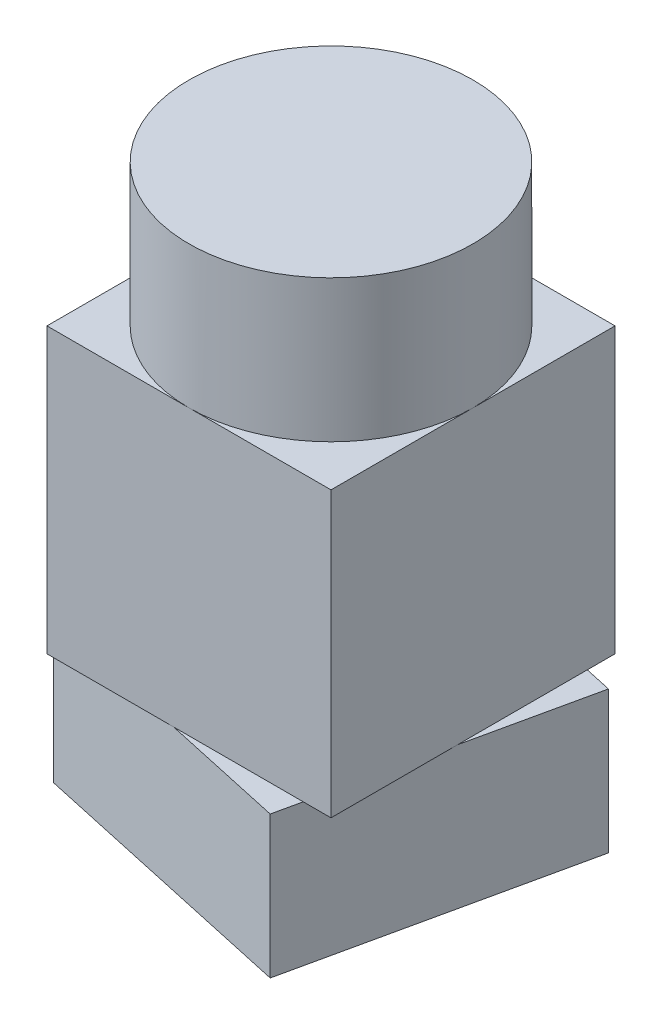
ISO-10303-21;
HEADER;
FILE_DESCRIPTION(('STEP AP214'),'2;1');
FILE_NAME('part.step','',(''),(''),'','','');
FILE_SCHEMA(('AUTOMOTIVE_DESIGN { 1 0 10303 214 1 1 1 1 }'));
ENDSEC;
DATA;
#1=APPLICATION_CONTEXT('core data for automotive mechanical design processes');
#2=APPLICATION_PROTOCOL_DEFINITION('international standard','automotive_design',2000,#1);
#3=PRODUCT_CONTEXT('',#1,'mechanical');
#4=PRODUCT('Part','Part','',(#3));
#5=PRODUCT_RELATED_PRODUCT_CATEGORY('part','',(#4));
#6=PRODUCT_DEFINITION_FORMATION('','',#4);
#7=PRODUCT_DEFINITION_CONTEXT('part definition',#1,'design');
#8=PRODUCT_DEFINITION('design','',#6,#7);
#9=PRODUCT_DEFINITION_SHAPE('','',#8);
#10=(LENGTH_UNIT() NAMED_UNIT(*) SI_UNIT(.MILLI.,.METRE.));
#11=(NAMED_UNIT(*) PLANE_ANGLE_UNIT() SI_UNIT($,.RADIAN.));
#12=(NAMED_UNIT(*) SI_UNIT($,.STERADIAN.) SOLID_ANGLE_UNIT());
#13=UNCERTAINTY_MEASURE_WITH_UNIT(LENGTH_MEASURE(1.E-05),#10,'distance_accuracy_value','');
#14=(GEOMETRIC_REPRESENTATION_CONTEXT(3) GLOBAL_UNCERTAINTY_ASSIGNED_CONTEXT((#13)) GLOBAL_UNIT_ASSIGNED_CONTEXT((#10,
#11,#12)) REPRESENTATION_CONTEXT('',''));
#15=CARTESIAN_POINT('',(0.,0.,0.));
#16=DIRECTION('',(0.,0.,1.));
#17=DIRECTION('',(1.,0.,0.));
#18=AXIS2_PLACEMENT_3D('',#15,#16,#17);
#19=CARTESIAN_POINT('',(0.,-4.,0.));
#20=DIRECTION('',(0.,-1.,0.));
#21=DIRECTION('',(0.,0.,-1.));
#22=AXIS2_PLACEMENT_3D('',#19,#20,#21);
#23=PLANE('',#22);
#24=DIRECTION('',(-1.,0.,0.));
#25=VECTOR('',#24,1.);
#26=CARTESIAN_POINT('',(0.,-4.,-58.3815572471546));
#27=LINE('',#26,#25);
#28=CARTESIAN_POINT('',(2.,-4.,-58.3815572471546));
#29=VERTEX_POINT('',#28);
#30=CARTESIAN_POINT('',(0.,-4.,-58.3815572471546));
#31=VERTEX_POINT('',#30);
#32=EDGE_CURVE('E144',#29,#31,#27,.T.);
#33=ORIENTED_EDGE('',*,*,#32,.T.);
#34=CARTESIAN_POINT('',(0.,-4.,-56.3815572471546));
#35=DIRECTION('',(0.,-1.,0.));
#36=DIRECTION('',(0.,0.,-1.));
#37=AXIS2_PLACEMENT_3D('',#34,#35,#36);
#38=CIRCLE('',#37,2.);
#39=CARTESIAN_POINT('',(2.,-4.,-56.3815572471546));
#40=VERTEX_POINT('',#39);
#41=EDGE_CURVE('E44',#31,#40,#38,.T.);
#42=ORIENTED_EDGE('',*,*,#41,.T.);
#43=DIRECTION('',(0.,0.,1.));
#44=VECTOR('',#43,1.);
#45=CARTESIAN_POINT('',(2.,-4.,0.));
#46=LINE('',#45,#44);
#47=EDGE_CURVE('E142',#29,#40,#46,.T.);
#48=ORIENTED_EDGE('',*,*,#47,.F.);
#49=EDGE_LOOP('',(#33,#42,#48));
#50=FACE_BOUND('',#49,.T.);
#51=ADVANCED_FACE('F33',(#50),#23,.F.);
#52=CARTESIAN_POINT('',(2.,-4.,-54.3815572471546));
#53=VERTEX_POINT('',#52);
#54=EDGE_CURVE('E147',#40,#53,#46,.T.);
#55=ORIENTED_EDGE('',*,*,#54,.F.);
#56=CARTESIAN_POINT('',(0.,-4.,-54.3815572471546));
#57=VERTEX_POINT('',#56);
#58=EDGE_CURVE('E11',#40,#57,#38,.T.);
#59=ORIENTED_EDGE('',*,*,#58,.T.);
#60=DIRECTION('',(-1.,0.,0.));
#61=VECTOR('',#60,1.);
#62=CARTESIAN_POINT('',(0.,-4.,-54.3815572471546));
#63=LINE('',#62,#61);
#64=EDGE_CURVE('E150',#53,#57,#63,.T.);
#65=ORIENTED_EDGE('',*,*,#64,.F.);
#66=EDGE_LOOP('',(#55,#59,#65));
#67=FACE_BOUND('',#66,.T.);
#68=ADVANCED_FACE('F148',(#67),#23,.F.);
#69=CARTESIAN_POINT('',(-2.,-4.,-54.3815572471546));
#70=VERTEX_POINT('',#69);
#71=EDGE_CURVE('E160',#57,#70,#63,.T.);
#72=ORIENTED_EDGE('',*,*,#71,.F.);
#73=CARTESIAN_POINT('',(-2.,-4.,-56.3815572471546));
#74=VERTEX_POINT('',#73);
#75=EDGE_CURVE('E42',#57,#74,#38,.T.);
#76=ORIENTED_EDGE('',*,*,#75,.T.);
#77=DIRECTION('',(0.,0.,1.));
#78=VECTOR('',#77,1.);
#79=CARTESIAN_POINT('',(-2.00000000000001,-4.,0.));
#80=LINE('',#79,#78);
#81=EDGE_CURVE('E241',#74,#70,#80,.T.);
#82=ORIENTED_EDGE('',*,*,#81,.T.);
#83=EDGE_LOOP('',(#72,#76,#82));
#84=FACE_BOUND('',#83,.T.);
#85=ADVANCED_FACE('F293',(#84),#23,.F.);
#86=CARTESIAN_POINT('',(0.,-8.,0.));
#87=DIRECTION('',(0.,1.,0.));
#88=DIRECTION('',(0.,0.,1.));
#89=AXIS2_PLACEMENT_3D('',#86,#87,#88);
#90=PLANE('',#89);
#91=DIRECTION('',(-0.214029557563819,0.,0.976827184556734));
#92=VECTOR('',#91,1.);
#93=CARTESIAN_POINT('',(-1.52559525398583,-8.,-58.7632707313957));
#94=LINE('',#93,#92);
#95=CARTESIAN_POINT('',(-1.52559525398583,-8.,-58.7632707313957));
#96=VERTEX_POINT('',#95);
#97=CARTESIAN_POINT('',(-1.60923130490649,-8.,-58.3815572471546));
#98=VERTEX_POINT('',#97);
#99=EDGE_CURVE('E165',#96,#98,#94,.T.);
#100=ORIENTED_EDGE('',*,*,#99,.T.);
#101=DIRECTION('',(1.,0.,0.));
#102=VECTOR('',#101,1.);
#103=CARTESIAN_POINT('',(0.,-8.,-58.3815572471546));
#104=LINE('',#103,#102);
#105=CARTESIAN_POINT('',(0.216538460454042,-8.,-58.3815572471546));
#106=VERTEX_POINT('',#105);
#107=EDGE_CURVE('E236',#98,#106,#104,.T.);
#108=ORIENTED_EDGE('',*,*,#107,.T.);
#109=DIRECTION('',(0.976827184556734,0.,0.214029557563819));
#110=VECTOR('',#109,1.);
#111=CARTESIAN_POINT('',(-1.52559525398583,-8.,-58.7632707313957));
#112=LINE('',#111,#110);
#113=EDGE_CURVE('E181',#96,#106,#112,.T.);
#114=ORIENTED_EDGE('',*,*,#113,.F.);
#115=EDGE_LOOP('',(#100,#108,#114));
#116=FACE_BOUND('',#115,.T.);
#117=ADVANCED_FACE('F274',(#116),#90,.T.);
#118=DIRECTION('',(0.,0.,-1.));
#119=VECTOR('',#118,1.);
#120=CARTESIAN_POINT('',(2.,-8.,0.));
#121=LINE('',#120,#119);
#122=CARTESIAN_POINT('',(2.,-8.,-56.1650187867006));
#123=VERTEX_POINT('',#122);
#124=CARTESIAN_POINT('',(2.,-8.,-57.9907885520611));
#125=VERTEX_POINT('',#124);
#126=EDGE_CURVE('E216',#123,#125,#121,.T.);
#127=ORIENTED_EDGE('',*,*,#126,.F.);
#128=DIRECTION('',(-0.214029557563819,0.,0.976827184556734));
#129=VECTOR('',#128,1.);
#130=CARTESIAN_POINT('',(2.38171348424111,-8.,-57.9071525011405));
#131=LINE('',#130,#129);
#132=CARTESIAN_POINT('',(2.38171348424111,-8.,-57.9071525011405));
#133=VERTEX_POINT('',#132);
#134=EDGE_CURVE('E176',#133,#123,#131,.T.);
#135=ORIENTED_EDGE('',*,*,#134,.F.);
#136=EDGE_CURVE('E179',#125,#133,#112,.T.);
#137=ORIENTED_EDGE('',*,*,#136,.F.);
#138=EDGE_LOOP('',(#127,#135,#137));
#139=FACE_BOUND('',#138,.T.);
#140=ADVANCED_FACE('F301',(#139),#90,.T.);
#141=DIRECTION('',(0.976827184556734,0.,0.214029557563819));
#142=VECTOR('',#141,1.);
#143=CARTESIAN_POINT('',(-2.38171348424111,-8.,-54.8559619931688));
#144=LINE('',#143,#142);
#145=CARTESIAN_POINT('',(-2.38171348424111,-8.,-54.8559619931688));
#146=VERTEX_POINT('',#145);
#147=CARTESIAN_POINT('',(-2.,-8.,-54.7723259422482));
#148=VERTEX_POINT('',#147);
#149=EDGE_CURVE('E171',#146,#148,#144,.T.);
#150=ORIENTED_EDGE('',*,*,#149,.T.);
#151=DIRECTION('',(0.,0.,-1.));
#152=VECTOR('',#151,1.);
#153=CARTESIAN_POINT('',(-2.00000000000001,-8.,0.));
#154=LINE('',#153,#152);
#155=CARTESIAN_POINT('',(-2.,-8.,-56.5980957076087));
#156=VERTEX_POINT('',#155);
#157=EDGE_CURVE('E205',#148,#156,#154,.T.);
#158=ORIENTED_EDGE('',*,*,#157,.T.);
#159=EDGE_CURVE('E170',#156,#146,#94,.T.);
#160=ORIENTED_EDGE('',*,*,#159,.T.);
#161=EDGE_LOOP('',(#150,#158,#160));
#162=FACE_BOUND('',#161,.T.);
#163=ADVANCED_FACE('F337',(#162),#90,.T.);
#164=CARTESIAN_POINT('',(-1.52559525398583,-8.,-58.7632707313957));
#165=DIRECTION('',(0.976827184556734,0.,0.214029557563819));
#166=DIRECTION('',(0.214029557563819,0.,-0.976827184556734));
#167=AXIS2_PLACEMENT_3D('',#164,#165,#166);
#168=PLANE('',#167);
#169=DIRECTION('',(-0.214029557563819,0.,0.976827184556734));
#170=VECTOR('',#169,1.);
#171=CARTESIAN_POINT('',(-1.52559525398583,-10.,-58.7632707313957));
#172=LINE('',#171,#170);
#173=CARTESIAN_POINT('',(-1.52559525398583,-10.,-58.7632707313957));
#174=VERTEX_POINT('',#173);
#175=CARTESIAN_POINT('',(-2.38171348424111,-10.,-54.8559619931688));
#176=VERTEX_POINT('',#175);
#177=EDGE_CURVE('E186',#174,#176,#172,.T.);
#178=ORIENTED_EDGE('',*,*,#177,.T.);
#179=DIRECTION('',(0.,-1.,0.));
#180=VECTOR('',#179,1.);
#181=CARTESIAN_POINT('',(-2.38171348424111,-8.,-54.8559619931688));
#182=LINE('',#181,#180);
#183=EDGE_CURVE('E37',#146,#176,#182,.T.);
#184=ORIENTED_EDGE('',*,*,#183,.F.);
#185=ORIENTED_EDGE('',*,*,#159,.F.);
#186=EDGE_CURVE('E169',#98,#156,#94,.T.);
#187=ORIENTED_EDGE('',*,*,#186,.F.);
#188=ORIENTED_EDGE('',*,*,#99,.F.);
#189=DIRECTION('',(0.,-1.,0.));
#190=VECTOR('',#189,1.);
#191=CARTESIAN_POINT('',(-1.52559525398583,-8.,-58.7632707313957));
#192=LINE('',#191,#190);
#193=EDGE_CURVE('E184',#96,#174,#192,.T.);
#194=ORIENTED_EDGE('',*,*,#193,.T.);
#195=EDGE_LOOP('',(#178,#184,#185,#187,#188,#194));
#196=FACE_BOUND('',#195,.T.);
#197=ADVANCED_FACE('F35',(#196),#168,.F.);
#198=CARTESIAN_POINT('',(-2.38171348424111,-8.,-54.8559619931688));
#199=DIRECTION('',(0.214029557563819,0.,-0.976827184556734));
#200=DIRECTION('',(-0.976827184556734,0.,-0.214029557563819));
#201=AXIS2_PLACEMENT_3D('',#198,#199,#200);
#202=PLANE('',#201);
#203=DIRECTION('',(0.976827184556734,0.,0.214029557563819));
#204=VECTOR('',#203,1.);
#205=CARTESIAN_POINT('',(-2.38171348424111,-10.,-54.8559619931688));
#206=LINE('',#205,#204);
#207=CARTESIAN_POINT('',(1.52559525398583,-10.,-53.9998437629135));
#208=VERTEX_POINT('',#207);
#209=EDGE_CURVE('E189',#176,#208,#206,.T.);
#210=ORIENTED_EDGE('',*,*,#209,.T.);
#211=DIRECTION('',(0.,-1.,0.));
#212=VECTOR('',#211,1.);
#213=CARTESIAN_POINT('',(1.52559525398583,-8.,-53.9998437629135));
#214=LINE('',#213,#212);
#215=CARTESIAN_POINT('',(1.52559525398583,-8.,-53.9998437629135));
#216=VERTEX_POINT('',#215);
#217=EDGE_CURVE('E200',#216,#208,#214,.T.);
#218=ORIENTED_EDGE('',*,*,#217,.F.);
#219=CARTESIAN_POINT('',(-0.216538460454049,-8.,-54.3815572471546));
#220=VERTEX_POINT('',#219);
#221=EDGE_CURVE('E168',#220,#216,#144,.T.);
#222=ORIENTED_EDGE('',*,*,#221,.F.);
#223=EDGE_CURVE('E175',#148,#220,#144,.T.);
#224=ORIENTED_EDGE('',*,*,#223,.F.);
#225=ORIENTED_EDGE('',*,*,#149,.F.);
#226=ORIENTED_EDGE('',*,*,#183,.T.);
#227=EDGE_LOOP('',(#210,#218,#222,#224,#225,#226));
#228=FACE_BOUND('',#227,.T.);
#229=ADVANCED_FACE('F280',(#228),#202,.F.);
#230=CARTESIAN_POINT('',(2.38171348424111,-8.,-57.9071525011405));
#231=DIRECTION('',(0.976827184556734,0.,0.214029557563819));
#232=DIRECTION('',(0.214029557563819,0.,-0.976827184556734));
#233=AXIS2_PLACEMENT_3D('',#230,#231,#232);
#234=PLANE('',#233);
#235=DIRECTION('',(-0.214029557563819,0.,0.976827184556734));
#236=VECTOR('',#235,1.);
#237=CARTESIAN_POINT('',(2.38171348424111,-10.,-57.9071525011405));
#238=LINE('',#237,#236);
#239=CARTESIAN_POINT('',(2.38171348424111,-10.,-57.9071525011405));
#240=VERTEX_POINT('',#239);
#241=EDGE_CURVE('E192',#240,#208,#238,.T.);
#242=ORIENTED_EDGE('',*,*,#241,.F.);
#243=DIRECTION('',(0.,-1.,0.));
#244=VECTOR('',#243,1.);
#245=CARTESIAN_POINT('',(2.38171348424111,-8.,-57.9071525011405));
#246=LINE('',#245,#244);
#247=EDGE_CURVE('E199',#133,#240,#246,.T.);
#248=ORIENTED_EDGE('',*,*,#247,.F.);
#249=ORIENTED_EDGE('',*,*,#134,.T.);
#250=CARTESIAN_POINT('',(1.60923130490649,-8.,-54.3815572471546));
#251=VERTEX_POINT('',#250);
#252=EDGE_CURVE('E180',#123,#251,#131,.T.);
#253=ORIENTED_EDGE('',*,*,#252,.T.);
#254=EDGE_CURVE('E174',#251,#216,#131,.T.);
#255=ORIENTED_EDGE('',*,*,#254,.T.);
#256=ORIENTED_EDGE('',*,*,#217,.T.);
#257=EDGE_LOOP('',(#242,#248,#249,#253,#255,#256));
#258=FACE_BOUND('',#257,.T.);
#259=ADVANCED_FACE('F361',(#258),#234,.T.);
#260=CARTESIAN_POINT('',(-1.52559525398583,-8.,-58.7632707313957));
#261=DIRECTION('',(0.214029557563819,0.,-0.976827184556734));
#262=DIRECTION('',(-0.976827184556734,0.,-0.214029557563819));
#263=AXIS2_PLACEMENT_3D('',#260,#261,#262);
#264=PLANE('',#263);
#265=DIRECTION('',(0.976827184556734,0.,0.214029557563819));
#266=VECTOR('',#265,1.);
#267=CARTESIAN_POINT('',(-1.52559525398583,-10.,-58.7632707313957));
#268=LINE('',#267,#266);
#269=EDGE_CURVE('E195',#174,#240,#268,.T.);
#270=ORIENTED_EDGE('',*,*,#269,.F.);
#271=ORIENTED_EDGE('',*,*,#193,.F.);
#272=ORIENTED_EDGE('',*,*,#113,.T.);
#273=EDGE_CURVE('E185',#106,#125,#112,.T.);
#274=ORIENTED_EDGE('',*,*,#273,.T.);
#275=ORIENTED_EDGE('',*,*,#136,.T.);
#276=ORIENTED_EDGE('',*,*,#247,.T.);
#277=EDGE_LOOP('',(#270,#271,#272,#274,#275,#276));
#278=FACE_BOUND('',#277,.T.);
#279=ADVANCED_FACE('F276',(#278),#264,.T.);
#280=DIRECTION('',(1.,0.,0.));
#281=VECTOR('',#280,1.);
#282=CARTESIAN_POINT('',(0.,-8.,-54.3815572471546));
#283=LINE('',#282,#281);
#284=EDGE_CURVE('E210',#220,#251,#283,.T.);
#285=ORIENTED_EDGE('',*,*,#284,.F.);
#286=ORIENTED_EDGE('',*,*,#221,.T.);
#287=ORIENTED_EDGE('',*,*,#254,.F.);
#288=EDGE_LOOP('',(#285,#286,#287));
#289=FACE_BOUND('',#288,.T.);
#290=ADVANCED_FACE('F303',(#289),#90,.T.);
#291=CARTESIAN_POINT('',(0.,-10.,0.));
#292=DIRECTION('',(0.,1.,0.));
#293=DIRECTION('',(0.,0.,1.));
#294=AXIS2_PLACEMENT_3D('',#291,#292,#293);
#295=PLANE('',#294);
#296=ORIENTED_EDGE('',*,*,#177,.F.);
#297=ORIENTED_EDGE('',*,*,#269,.T.);
#298=ORIENTED_EDGE('',*,*,#241,.T.);
#299=ORIENTED_EDGE('',*,*,#209,.F.);
#300=EDGE_LOOP('',(#296,#297,#298,#299));
#301=FACE_BOUND('',#300,.T.);
#302=ADVANCED_FACE('F279',(#301),#295,.F.);
#303=CARTESIAN_POINT('',(0.,-8.,0.));
#304=DIRECTION('',(0.,1.,0.));
#305=DIRECTION('',(0.,0.,1.));
#306=AXIS2_PLACEMENT_3D('',#303,#304,#305);
#307=PLANE('',#306);
#308=CARTESIAN_POINT('',(-2.,-8.,-58.3815572471546));
#309=VERTEX_POINT('',#308);
#310=EDGE_CURVE('E233',#309,#98,#104,.T.);
#311=ORIENTED_EDGE('',*,*,#310,.T.);
#312=ORIENTED_EDGE('',*,*,#186,.T.);
#313=EDGE_CURVE('E58',#156,#309,#154,.T.);
#314=ORIENTED_EDGE('',*,*,#313,.T.);
#315=EDGE_LOOP('',(#311,#312,#314));
#316=FACE_BOUND('',#315,.T.);
#317=ADVANCED_FACE('F271',(#316),#307,.F.);
#318=CARTESIAN_POINT('',(-2.,-8.,-54.3815572471546));
#319=VERTEX_POINT('',#318);
#320=EDGE_CURVE('E212',#319,#148,#154,.T.);
#321=ORIENTED_EDGE('',*,*,#320,.T.);
#322=ORIENTED_EDGE('',*,*,#223,.T.);
#323=EDGE_CURVE('E218',#319,#220,#283,.T.);
#324=ORIENTED_EDGE('',*,*,#323,.F.);
#325=EDGE_LOOP('',(#321,#322,#324));
#326=FACE_BOUND('',#325,.T.);
#327=ADVANCED_FACE('F287',(#326),#307,.F.);
#328=ORIENTED_EDGE('',*,*,#252,.F.);
#329=CARTESIAN_POINT('',(2.,-8.,-54.3815572471546));
#330=VERTEX_POINT('',#329);
#331=EDGE_CURVE('E228',#330,#123,#121,.T.);
#332=ORIENTED_EDGE('',*,*,#331,.F.);
#333=EDGE_CURVE('E219',#251,#330,#283,.T.);
#334=ORIENTED_EDGE('',*,*,#333,.F.);
#335=EDGE_LOOP('',(#328,#332,#334));
#336=FACE_BOUND('',#335,.T.);
#337=ADVANCED_FACE('F408',(#336),#307,.F.);
#338=ORIENTED_EDGE('',*,*,#273,.F.);
#339=CARTESIAN_POINT('',(2.,-8.,-58.3815572471546));
#340=VERTEX_POINT('',#339);
#341=EDGE_CURVE('E235',#106,#340,#104,.T.);
#342=ORIENTED_EDGE('',*,*,#341,.T.);
#343=EDGE_CURVE('E232',#125,#340,#121,.T.);
#344=ORIENTED_EDGE('',*,*,#343,.F.);
#345=EDGE_LOOP('',(#338,#342,#344));
#346=FACE_BOUND('',#345,.T.);
#347=ADVANCED_FACE('F255',(#346),#307,.F.);
#348=CARTESIAN_POINT('',(2.,1.65685424949238,0.));
#349=DIRECTION('',(-1.,0.,0.));
#350=DIRECTION('',(0.,0.,1.));
#351=AXIS2_PLACEMENT_3D('',#348,#349,#350);
#352=PLANE('',#351);
#353=DIRECTION('',(0.,-1.,0.));
#354=VECTOR('',#353,1.);
#355=CARTESIAN_POINT('',(2.,1.65685424949238,-58.3815572471546));
#356=LINE('',#355,#354);
#357=EDGE_CURVE('E159',#29,#340,#356,.T.);
#358=ORIENTED_EDGE('',*,*,#357,.F.);
#359=ORIENTED_EDGE('',*,*,#47,.T.);
#360=ORIENTED_EDGE('',*,*,#54,.T.);
#361=DIRECTION('',(0.,-1.,0.));
#362=VECTOR('',#361,1.);
#363=CARTESIAN_POINT('',(2.,1.65685424949238,-54.3815572471546));
#364=LINE('',#363,#362);
#365=EDGE_CURVE('E262',#53,#330,#364,.T.);
#366=ORIENTED_EDGE('',*,*,#365,.T.);
#367=ORIENTED_EDGE('',*,*,#331,.T.);
#368=ORIENTED_EDGE('',*,*,#126,.T.);
#369=ORIENTED_EDGE('',*,*,#343,.T.);
#370=EDGE_LOOP('',(#358,#359,#360,#366,#367,#368,#369));
#371=FACE_BOUND('',#370,.T.);
#372=ADVANCED_FACE('F157',(#371),#352,.F.);
#373=CARTESIAN_POINT('',(0.,1.65685424949238,-54.3815572471546));
#374=DIRECTION('',(0.,0.,-1.));
#375=DIRECTION('',(-1.,0.,0.));
#376=AXIS2_PLACEMENT_3D('',#373,#374,#375);
#377=PLANE('',#376);
#378=ORIENTED_EDGE('',*,*,#365,.F.);
#379=ORIENTED_EDGE('',*,*,#64,.T.);
#380=ORIENTED_EDGE('',*,*,#71,.T.);
#381=DIRECTION('',(0.,-1.,0.));
#382=VECTOR('',#381,1.);
#383=CARTESIAN_POINT('',(-2.,1.65685424949238,-54.3815572471546));
#384=LINE('',#383,#382);
#385=EDGE_CURVE('E263',#70,#319,#384,.T.);
#386=ORIENTED_EDGE('',*,*,#385,.T.);
#387=ORIENTED_EDGE('',*,*,#323,.T.);
#388=ORIENTED_EDGE('',*,*,#284,.T.);
#389=ORIENTED_EDGE('',*,*,#333,.T.);
#390=EDGE_LOOP('',(#378,#379,#380,#386,#387,#388,#389));
#391=FACE_BOUND('',#390,.T.);
#392=ADVANCED_FACE('F291',(#391),#377,.F.);
#393=CARTESIAN_POINT('',(-2.00000000000001,1.65685424949238,0.));
#394=DIRECTION('',(-1.,0.,0.));
#395=DIRECTION('',(0.,0.,1.));
#396=AXIS2_PLACEMENT_3D('',#393,#394,#395);
#397=PLANE('',#396);
#398=CARTESIAN_POINT('',(-2.,-4.,-58.3815572471546));
#399=VERTEX_POINT('',#398);
#400=EDGE_CURVE('E239',#399,#74,#80,.T.);
#401=ORIENTED_EDGE('',*,*,#400,.F.);
#402=DIRECTION('',(0.,-1.,0.));
#403=VECTOR('',#402,1.);
#404=CARTESIAN_POINT('',(-2.,1.65685424949238,-58.3815572471546));
#405=LINE('',#404,#403);
#406=EDGE_CURVE('E154',#399,#309,#405,.T.);
#407=ORIENTED_EDGE('',*,*,#406,.T.);
#408=ORIENTED_EDGE('',*,*,#313,.F.);
#409=ORIENTED_EDGE('',*,*,#157,.F.);
#410=ORIENTED_EDGE('',*,*,#320,.F.);
#411=ORIENTED_EDGE('',*,*,#385,.F.);
#412=ORIENTED_EDGE('',*,*,#81,.F.);
#413=EDGE_LOOP('',(#401,#407,#408,#409,#410,#411,#412));
#414=FACE_BOUND('',#413,.T.);
#415=ADVANCED_FACE('F268',(#414),#397,.T.);
#416=CARTESIAN_POINT('',(0.,1.65685424949238,-58.3815572471546));
#417=DIRECTION('',(0.,0.,-1.));
#418=DIRECTION('',(-1.,0.,0.));
#419=AXIS2_PLACEMENT_3D('',#416,#417,#418);
#420=PLANE('',#419);
#421=ORIENTED_EDGE('',*,*,#32,.F.);
#422=ORIENTED_EDGE('',*,*,#357,.T.);
#423=ORIENTED_EDGE('',*,*,#341,.F.);
#424=ORIENTED_EDGE('',*,*,#107,.F.);
#425=ORIENTED_EDGE('',*,*,#310,.F.);
#426=ORIENTED_EDGE('',*,*,#406,.F.);
#427=EDGE_CURVE('E238',#31,#399,#27,.T.);
#428=ORIENTED_EDGE('',*,*,#427,.F.);
#429=EDGE_LOOP('',(#421,#422,#423,#424,#425,#426,#428));
#430=FACE_BOUND('',#429,.T.);
#431=ADVANCED_FACE('F259',(#430),#420,.T.);
#432=ORIENTED_EDGE('',*,*,#400,.T.);
#433=EDGE_CURVE('E146',#74,#31,#38,.T.);
#434=ORIENTED_EDGE('',*,*,#433,.T.);
#435=ORIENTED_EDGE('',*,*,#427,.T.);
#436=EDGE_LOOP('',(#432,#434,#435));
#437=FACE_BOUND('',#436,.T.);
#438=ADVANCED_FACE('F296',(#437),#23,.F.);
#439=CARTESIAN_POINT('',(0.,-2.,-56.3815572471546));
#440=DIRECTION('',(0.,-1.,0.));
#441=DIRECTION('',(0.,0.,-1.));
#442=AXIS2_PLACEMENT_3D('',#439,#440,#441);
#443=CYLINDRICAL_SURFACE('',#442,2.);
#444=CARTESIAN_POINT('',(0.,-2.,-56.3815572471546));
#445=DIRECTION('',(0.,-1.,0.));
#446=DIRECTION('',(0.,0.,-1.));
#447=AXIS2_PLACEMENT_3D('',#444,#445,#446);
#448=CIRCLE('',#447,2.);
#449=CARTESIAN_POINT('',(0.,-2.,-58.3815572471546));
#450=VERTEX_POINT('',#449);
#451=EDGE_CURVE('E145',#450,#450,#448,.T.);
#452=ORIENTED_EDGE('',*,*,#451,.T.);
#453=EDGE_LOOP('',(#452));
#454=FACE_BOUND('',#453,.T.);
#455=ORIENTED_EDGE('',*,*,#41,.F.);
#456=ORIENTED_EDGE('',*,*,#433,.F.);
#457=ORIENTED_EDGE('',*,*,#75,.F.);
#458=ORIENTED_EDGE('',*,*,#58,.F.);
#459=EDGE_LOOP('',(#455,#456,#457,#458));
#460=FACE_BOUND('',#459,.T.);
#461=ADVANCED_FACE('F133',(#454,#460),#443,.T.);
#462=CARTESIAN_POINT('',(0.,-2.,-56.3815572471546));
#463=DIRECTION('',(0.,-1.,0.));
#464=DIRECTION('',(0.,0.,-1.));
#465=AXIS2_PLACEMENT_3D('',#462,#463,#464);
#466=PLANE('',#465);
#467=ORIENTED_EDGE('',*,*,#451,.F.);
#468=EDGE_LOOP('',(#467));
#469=FACE_BOUND('',#468,.T.);
#470=ADVANCED_FACE('F467',(#469),#466,.F.);
#471=CLOSED_SHELL('',(#51,#68,#85,#117,#140,#163,#197,#229,#259,#279,#290,#302,#317,#327,#337,
#347,#372,#392,#415,#431,#438,#461,#470));
#472=MANIFOLD_SOLID_BREP('B2',#471);
#473=ADVANCED_BREP_SHAPE_REPRESENTATION('',(#18,#472),#14);
#474=SHAPE_DEFINITION_REPRESENTATION(#9,#473);
ENDSEC;
END-ISO-10303-21;
